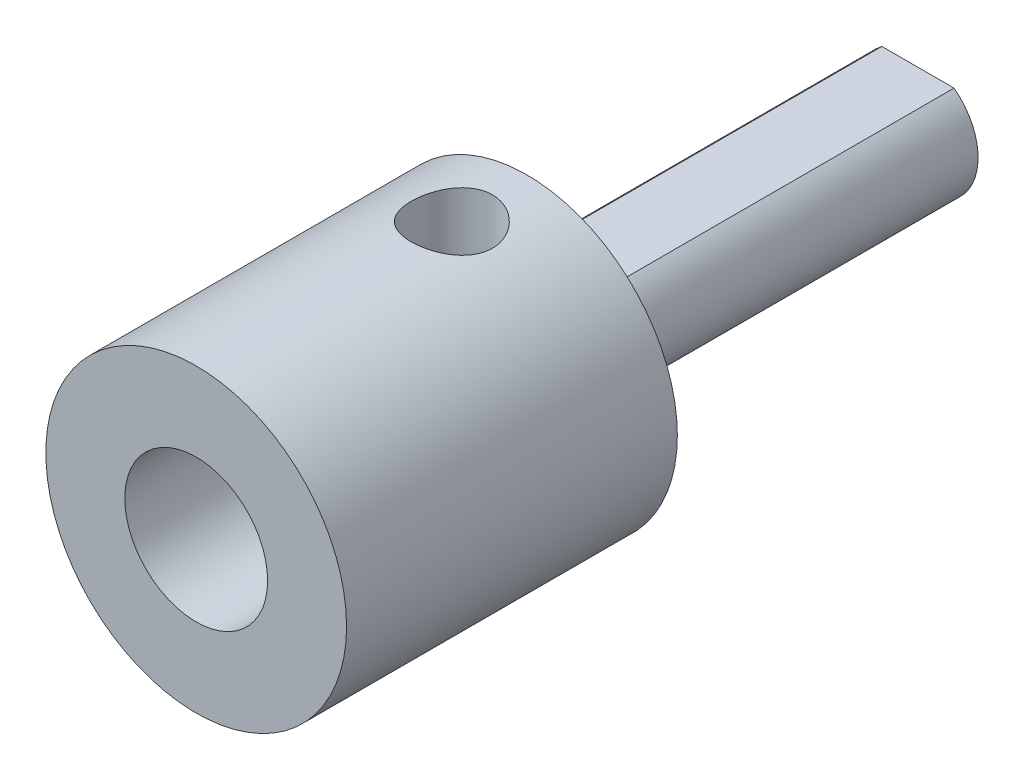
ISO-10303-21;
HEADER;
FILE_DESCRIPTION(('STEP AP214'),'2;1');
FILE_NAME('part.step','',(''),(''),'','','');
FILE_SCHEMA(('AUTOMOTIVE_DESIGN { 1 0 10303 214 1 1 1 1 }'));
ENDSEC;
DATA;
#1=APPLICATION_CONTEXT('core data for automotive mechanical design processes');
#2=APPLICATION_PROTOCOL_DEFINITION('international standard','automotive_design',2000,#1);
#3=PRODUCT_CONTEXT('',#1,'mechanical');
#4=PRODUCT('Part','Part','',(#3));
#5=PRODUCT_RELATED_PRODUCT_CATEGORY('part','',(#4));
#6=PRODUCT_DEFINITION_FORMATION('','',#4);
#7=PRODUCT_DEFINITION_CONTEXT('part definition',#1,'design');
#8=PRODUCT_DEFINITION('design','',#6,#7);
#9=PRODUCT_DEFINITION_SHAPE('','',#8);
#10=(LENGTH_UNIT() NAMED_UNIT(*) SI_UNIT(.MILLI.,.METRE.));
#11=(NAMED_UNIT(*) PLANE_ANGLE_UNIT() SI_UNIT($,.RADIAN.));
#12=(NAMED_UNIT(*) SI_UNIT($,.STERADIAN.) SOLID_ANGLE_UNIT());
#13=UNCERTAINTY_MEASURE_WITH_UNIT(LENGTH_MEASURE(1.E-05),#10,'distance_accuracy_value','');
#14=(GEOMETRIC_REPRESENTATION_CONTEXT(3) GLOBAL_UNCERTAINTY_ASSIGNED_CONTEXT((#13)) GLOBAL_UNIT_ASSIGNED_CONTEXT((#10,
#11,#12)) REPRESENTATION_CONTEXT('',''));
#15=CARTESIAN_POINT('',(0.,0.,0.));
#16=DIRECTION('',(0.,0.,1.));
#17=DIRECTION('',(1.,0.,0.));
#18=AXIS2_PLACEMENT_3D('',#15,#16,#17);
#19=CARTESIAN_POINT('',(0.,0.,0.));
#20=DIRECTION('',(0.,0.,1.));
#21=DIRECTION('',(1.,0.,0.));
#22=AXIS2_PLACEMENT_3D('',#19,#20,#21);
#23=PLANE('',#22);
#24=CARTESIAN_POINT('',(0.,0.,0.));
#25=DIRECTION('',(0.,0.,1.));
#26=DIRECTION('',(1.,0.,0.));
#27=AXIS2_PLACEMENT_3D('',#24,#25,#26);
#28=CIRCLE('',#27,5.);
#29=CARTESIAN_POINT('',(5.,0.,0.));
#30=VERTEX_POINT('',#29);
#31=EDGE_CURVE('E91',#30,#30,#28,.T.);
#32=ORIENTED_EDGE('',*,*,#31,.F.);
#33=EDGE_LOOP('',(#32));
#34=FACE_BOUND('',#33,.T.);
#35=CARTESIAN_POINT('',(0.,0.,0.));
#36=DIRECTION('',(0.,0.,-1.));
#37=DIRECTION('',(-1.,0.,0.));
#38=AXIS2_PLACEMENT_3D('',#35,#36,#37);
#39=CIRCLE('',#38,2.);
#40=CARTESIAN_POINT('',(1.2,1.6,0.));
#41=VERTEX_POINT('',#40);
#42=CARTESIAN_POINT('',(-1.2,1.6,0.));
#43=VERTEX_POINT('',#42);
#44=EDGE_CURVE('E56',#41,#43,#39,.T.);
#45=ORIENTED_EDGE('',*,*,#44,.F.);
#46=DIRECTION('',(-1.,0.,0.));
#47=VECTOR('',#46,1.);
#48=CARTESIAN_POINT('',(0.,1.6,0.));
#49=LINE('',#48,#47);
#50=EDGE_CURVE('E70',#41,#43,#49,.T.);
#51=ORIENTED_EDGE('',*,*,#50,.T.);
#52=EDGE_LOOP('',(#45,#51));
#53=FACE_BOUND('',#52,.T.);
#54=ADVANCED_FACE('F37',(#34,#53),#23,.F.);
#55=CARTESIAN_POINT('',(0.,0.,11.));
#56=DIRECTION('',(0.,0.,-1.));
#57=DIRECTION('',(-1.,0.,0.));
#58=AXIS2_PLACEMENT_3D('',#55,#56,#57);
#59=CYLINDRICAL_SURFACE('',#58,5.);
#60=CARTESIAN_POINT('',(0.,-5.,3.85254999999999));
#61=CARTESIAN_POINT('',(0.0745225185418701,-4.99999891715454,3.85254831498077));
#62=CARTESIAN_POINT('',(0.149062933026172,-4.99831757249608,3.84637033325616));
#63=CARTESIAN_POINT('',(0.29599386979551,-4.9917737409468,3.82186699812973));
#64=CARTESIAN_POINT('',(0.368383385110954,-4.98690978786678,3.80353604594991));
#65=CARTESIAN_POINT('',(0.50887059643589,-4.9745371678472,3.75536830363393));
#66=CARTESIAN_POINT('',(0.57697377998375,-4.96703196701687,3.72554658798245));
#67=CARTESIAN_POINT('',(0.707212208082806,-4.95016856283296,3.65530039542611));
#68=CARTESIAN_POINT('',(0.769347008814859,-4.94081022183489,3.61487513085584));
#69=CARTESIAN_POINT('',(0.887363728693609,-4.9210005306576,3.52355373816625));
#70=CARTESIAN_POINT('',(0.943083368346109,-4.91053007485072,3.47245203438852));
#71=CARTESIAN_POINT('',(1.04527549491167,-4.8897979315681,3.36166765668391));
#72=CARTESIAN_POINT('',(1.09174675439663,-4.87953627196544,3.30198384556364));
#73=CARTESIAN_POINT('',(1.17492101197207,-4.86018744137242,3.17442564231554));
#74=CARTESIAN_POINT('',(1.21143607903852,-4.85112433755132,3.10642472307627));
#75=CARTESIAN_POINT('',(1.27245048640325,-4.83548020361871,2.96496388108358));
#76=CARTESIAN_POINT('',(1.29695211396531,-4.82889870108512,2.89150500055209));
#77=CARTESIAN_POINT('',(1.33267816037057,-4.81916041200351,2.74301360043194));
#78=CARTESIAN_POINT('',(1.34419736621195,-4.81592772898658,2.66805710459758));
#79=CARTESIAN_POINT('',(1.354550801524,-4.8130264385934,2.51721118202058));
#80=CARTESIAN_POINT('',(1.35338747589842,-4.81335714427668,2.44132193790814));
#81=CARTESIAN_POINT('',(1.33864262599477,-4.81747741093888,2.29307586458958));
#82=CARTESIAN_POINT('',(1.32541914180672,-4.82116724106982,2.22068020934258));
#83=CARTESIAN_POINT('',(1.28750333862209,-4.83143013592613,2.07917543304961));
#84=CARTESIAN_POINT('',(1.26281007931925,-4.83800343703956,2.01006658197207));
#85=CARTESIAN_POINT('',(1.20236706472501,-4.85337941864864,1.87617024990532));
#86=CARTESIAN_POINT('',(1.16649283513454,-4.86220698464018,1.81144193723515));
#87=CARTESIAN_POINT('',(1.084793011612,-4.88108363177096,1.68879873301806));
#88=CARTESIAN_POINT('',(1.03896540763676,-4.89113295945924,1.63088522133975));
#89=CARTESIAN_POINT('',(0.936834771501843,-4.9117347953631,1.52147149581437));
#90=CARTESIAN_POINT('',(0.880231446744117,-4.92229286385737,1.47025222848972));
#91=CARTESIAN_POINT('',(0.759109365721067,-4.94242009197054,1.37797461650734));
#92=CARTESIAN_POINT('',(0.694590279478356,-4.95198921033328,1.33691669565213));
#93=CARTESIAN_POINT('',(0.55902482682546,-4.96912207851947,1.26599855802969));
#94=CARTESIAN_POINT('',(0.487949946060017,-4.97667645262231,1.23619043494803));
#95=CARTESIAN_POINT('',(0.341546492757304,-4.98886094697425,1.18902769673602));
#96=CARTESIAN_POINT('',(0.266218881738206,-4.99349172537009,1.171670278639));
#97=CARTESIAN_POINT('',(0.115844861748639,-4.99920722814325,1.15034568814558));
#98=CARTESIAN_POINT('',(0.0408563602438515,-5.00039303990367,1.14599668661598));
#99=CARTESIAN_POINT('',(-0.108778968102476,-4.99937628342001,1.14975618532833));
#100=CARTESIAN_POINT('',(-0.18342583051351,-4.99717407635451,1.15786335768404));
#101=CARTESIAN_POINT('',(-0.328887528750957,-4.98969412802459,1.18599230873376));
#102=CARTESIAN_POINT('',(-0.399746869171298,-4.98447168346502,1.20580000192707));
#103=CARTESIAN_POINT('',(-0.537129218064343,-4.97154474876873,1.25651814103433));
#104=CARTESIAN_POINT('',(-0.603651748859669,-4.96383998577081,1.2874298075612));
#105=CARTESIAN_POINT('',(-0.731947222220643,-4.94656753342053,1.36017916401072));
#106=CARTESIAN_POINT('',(-0.793598493546165,-4.9369656526649,1.40222310185792));
#107=CARTESIAN_POINT('',(-0.909104376659809,-4.91700831416227,1.49578523624903));
#108=CARTESIAN_POINT('',(-0.962957398166668,-4.9066527033538,1.54730536040303));
#109=CARTESIAN_POINT('',(-1.06295529758321,-4.88598127184649,1.66014105658185));
#110=CARTESIAN_POINT('',(-1.10883046135265,-4.87567536665577,1.72169792541274));
#111=CARTESIAN_POINT('',(-1.18960710423539,-4.85660004863629,1.85185517154865));
#112=CARTESIAN_POINT('',(-1.22450902982018,-4.84783057330078,1.92045526213325));
#113=CARTESIAN_POINT('',(-1.28208641194615,-4.83292245799489,2.06241863043107));
#114=CARTESIAN_POINT('',(-1.30483179467462,-4.82676881422789,2.13575188610576));
#115=CARTESIAN_POINT('',(-1.33760996250244,-4.81778931902919,2.28539789859631));
#116=CARTESIAN_POINT('',(-1.3476461120159,-4.81496258690466,2.36170986136638));
#117=CARTESIAN_POINT('',(-1.35452331821825,-4.81303203765954,2.51238152175697));
#118=CARTESIAN_POINT('',(-1.35179850115791,-4.81380572886924,2.58672012704893));
#119=CARTESIAN_POINT('',(-1.33424135718207,-4.81870120869171,2.73383546787176));
#120=CARTESIAN_POINT('',(-1.31940935918101,-4.82282290634955,2.80661224577748));
#121=CARTESIAN_POINT('',(-1.27831390640485,-4.83387600962356,2.94797385201618));
#122=CARTESIAN_POINT('',(-1.25214496237974,-4.84078415382057,3.01658810313876));
#123=CARTESIAN_POINT('',(-1.18919172462283,-4.85663174856998,3.14850467916756));
#124=CARTESIAN_POINT('',(-1.15240572195191,-4.86557152608811,3.21180614680048));
#125=CARTESIAN_POINT('',(-1.06795757203887,-4.88481247608129,3.33336623690192));
#126=CARTESIAN_POINT('',(-1.02000038776867,-4.89514662137543,3.39141470105638));
#127=CARTESIAN_POINT('',(-0.915128993800851,-4.91583061201491,3.49878113197134));
#128=CARTESIAN_POINT('',(-0.85821259526013,-4.92618046058319,3.54809695897137));
#129=CARTESIAN_POINT('',(-0.735513498938369,-4.946004645656,3.63767656489852));
#130=CARTESIAN_POINT('',(-0.66956197626517,-4.95545443576335,3.67771500599581));
#131=CARTESIAN_POINT('',(-0.531610130662581,-4.97214273531939,3.74607367867092));
#132=CARTESIAN_POINT('',(-0.459613611471916,-4.9793826222218,3.77440121368677));
#133=CARTESIAN_POINT('',(-0.32326715845194,-4.98993181246584,3.81496332304056));
#134=CARTESIAN_POINT('',(-0.259488809547496,-4.99367947926639,3.82902502123403));
#135=CARTESIAN_POINT('',(-0.1304781107203,-4.99871391778584,3.8478186072404));
#136=CARTESIAN_POINT('',(-0.0652459142870346,-5.00000094805226,3.85255147526709));
#137=CARTESIAN_POINT('',(0.,-5.,3.85254999999999));
#138=B_SPLINE_CURVE_WITH_KNOTS('',3,(#60,#61,#62,#63,#64,#65,#66,#67,#68,#69,#70,#71,#72,#73,
#74,#75,#76,#77,#78,#79,#80,#81,#82,#83,#84,#85,#86,#87,#88,#89,#90,#91,#92,#93,#94,#95,#96,#97,
#98,#99,#100,#101,#102,#103,#104,#105,#106,#107,#108,#109,#110,#111,#112,#113,#114,#115,#116,
#117,#118,#119,#120,#121,#122,#123,#124,#125,#126,#127,#128,#129,#130,#131,#132,#133,#134,#135,
#136,#137),.UNSPECIFIED.,.T.,.F.,(4,2,2,2,2,2,2,2,2,2,2,2,2,2,2,2,2,2,2,2,2,2,2,2,2,2,2,2,2,2,2,
2,2,2,2,2,2,2,4),(0.,0.223328240071187,0.446759437267955,0.669898512412245,0.893054167734646,
1.120985668944,1.34894740066142,1.5809535170925,1.8129154442266,2.03949693394301,
2.26603474467196,2.48605858962697,2.70610047559203,2.92868522848933,3.15131497332918,
3.381426755652,3.61154813370365,3.84272241292757,4.07384463266284,4.29811281376289,
4.52235708848744,4.74262016412743,4.96290745977075,5.18760259576699,5.4123434890508,
5.64362027688297,5.87488765346766,6.10481002534246,6.33467151896625,6.55677107988131,
6.77886460724308,6.99914123854049,7.21945334571729,7.44642213132786,7.67344645443626,
7.90551228359271,8.13743316712962,8.33298193267733,8.52851015011636),.UNSPECIFIED.);
#139=CARTESIAN_POINT('',(0.,-5.,3.85254999999999));
#140=VERTEX_POINT('',#139);
#141=EDGE_CURVE('E11',#140,#140,#138,.T.);
#142=ORIENTED_EDGE('',*,*,#141,.T.);
#143=EDGE_LOOP('',(#142));
#144=FACE_BOUND('',#143,.T.);
#145=CARTESIAN_POINT('',(0.,5.,3.85254999999999));
#146=CARTESIAN_POINT('',(-0.0745225185418701,4.99999891715454,3.85254831498077));
#147=CARTESIAN_POINT('',(-0.149062933026172,4.99831757249608,3.84637033325616));
#148=CARTESIAN_POINT('',(-0.29599386979551,4.9917737409468,3.82186699812973));
#149=CARTESIAN_POINT('',(-0.368383385110954,4.98690978786678,3.80353604594991));
#150=CARTESIAN_POINT('',(-0.508870596435891,4.9745371678472,3.75536830363393));
#151=CARTESIAN_POINT('',(-0.57697377998375,4.96703196701687,3.72554658798245));
#152=CARTESIAN_POINT('',(-0.707212208082806,4.95016856283296,3.65530039542611));
#153=CARTESIAN_POINT('',(-0.769347008814859,4.94081022183489,3.61487513085584));
#154=CARTESIAN_POINT('',(-0.887363728693609,4.9210005306576,3.52355373816625));
#155=CARTESIAN_POINT('',(-0.943083368346109,4.91053007485072,3.47245203438852));
#156=CARTESIAN_POINT('',(-1.04527549491167,4.8897979315681,3.36166765668391));
#157=CARTESIAN_POINT('',(-1.09174675439663,4.87953627196544,3.30198384556364));
#158=CARTESIAN_POINT('',(-1.17492101197207,4.86018744137242,3.17442564231554));
#159=CARTESIAN_POINT('',(-1.21143607903852,4.85112433755132,3.10642472307627));
#160=CARTESIAN_POINT('',(-1.27245048640325,4.83548020361871,2.96496388108358));
#161=CARTESIAN_POINT('',(-1.29695211396531,4.82889870108512,2.89150500055209));
#162=CARTESIAN_POINT('',(-1.33267816037057,4.81916041200351,2.74301360043194));
#163=CARTESIAN_POINT('',(-1.34419736621195,4.81592772898658,2.66805710459758));
#164=CARTESIAN_POINT('',(-1.354550801524,4.8130264385934,2.51721118202058));
#165=CARTESIAN_POINT('',(-1.35338747589842,4.81335714427668,2.44132193790814));
#166=CARTESIAN_POINT('',(-1.33864262599477,4.81747741093888,2.29307586458958));
#167=CARTESIAN_POINT('',(-1.32541914180672,4.82116724106982,2.22068020934258));
#168=CARTESIAN_POINT('',(-1.28750333862209,4.83143013592613,2.07917543304961));
#169=CARTESIAN_POINT('',(-1.26281007931925,4.83800343703956,2.01006658197207));
#170=CARTESIAN_POINT('',(-1.202367064725,4.85337941864864,1.87617024990532));
#171=CARTESIAN_POINT('',(-1.16649283513454,4.86220698464018,1.81144193723515));
#172=CARTESIAN_POINT('',(-1.084793011612,4.88108363177096,1.68879873301806));
#173=CARTESIAN_POINT('',(-1.03896540763676,4.89113295945924,1.63088522133975));
#174=CARTESIAN_POINT('',(-0.936834771501842,4.9117347953631,1.52147149581436));
#175=CARTESIAN_POINT('',(-0.880231446744117,4.92229286385737,1.47025222848972));
#176=CARTESIAN_POINT('',(-0.759109365721067,4.94242009197054,1.37797461650734));
#177=CARTESIAN_POINT('',(-0.694590279478355,4.95198921033329,1.33691669565213));
#178=CARTESIAN_POINT('',(-0.559024826825459,4.96912207851947,1.26599855802969));
#179=CARTESIAN_POINT('',(-0.487949946060016,4.97667645262231,1.23619043494803));
#180=CARTESIAN_POINT('',(-0.341546492757303,4.98886094697425,1.18902769673602));
#181=CARTESIAN_POINT('',(-0.266218881738205,4.99349172537009,1.171670278639));
#182=CARTESIAN_POINT('',(-0.115844861748638,4.99920722814325,1.15034568814558));
#183=CARTESIAN_POINT('',(-0.0408563602438501,5.00039303990367,1.14599668661598));
#184=CARTESIAN_POINT('',(0.108778968102478,4.99937628342001,1.14975618532833));
#185=CARTESIAN_POINT('',(0.183425830513511,4.99717407635451,1.15786335768404));
#186=CARTESIAN_POINT('',(0.328887528750958,4.98969412802459,1.18599230873376));
#187=CARTESIAN_POINT('',(0.399746869171299,4.98447168346502,1.20580000192707));
#188=CARTESIAN_POINT('',(0.537129218064343,4.97154474876873,1.25651814103433));
#189=CARTESIAN_POINT('',(0.60365174885967,4.96383998577081,1.2874298075612));
#190=CARTESIAN_POINT('',(0.731947222220643,4.94656753342053,1.36017916401072));
#191=CARTESIAN_POINT('',(0.793598493546165,4.9369656526649,1.40222310185792));
#192=CARTESIAN_POINT('',(0.909104376659809,4.91700831416227,1.49578523624903));
#193=CARTESIAN_POINT('',(0.962957398166669,4.9066527033538,1.54730536040303));
#194=CARTESIAN_POINT('',(1.06295529758321,4.88598127184649,1.66014105658185));
#195=CARTESIAN_POINT('',(1.10883046135265,4.87567536665577,1.72169792541274));
#196=CARTESIAN_POINT('',(1.18960710423539,4.85660004863629,1.85185517154865));
#197=CARTESIAN_POINT('',(1.22450902982019,4.84783057330078,1.92045526213325));
#198=CARTESIAN_POINT('',(1.28208641194615,4.83292245799489,2.06241863043107));
#199=CARTESIAN_POINT('',(1.30483179467462,4.82676881422789,2.13575188610576));
#200=CARTESIAN_POINT('',(1.33760996250244,4.81778931902919,2.28539789859631));
#201=CARTESIAN_POINT('',(1.3476461120159,4.81496258690466,2.36170986136638));
#202=CARTESIAN_POINT('',(1.35452331821825,4.81303203765954,2.51238152175697));
#203=CARTESIAN_POINT('',(1.35179850115791,4.81380572886923,2.58672012704894));
#204=CARTESIAN_POINT('',(1.33424135718207,4.81870120869171,2.73383546787176));
#205=CARTESIAN_POINT('',(1.31940935918101,4.82282290634955,2.80661224577748));
#206=CARTESIAN_POINT('',(1.27831390640485,4.83387600962356,2.94797385201618));
#207=CARTESIAN_POINT('',(1.25214496237974,4.84078415382057,3.01658810313876));
#208=CARTESIAN_POINT('',(1.18919172462283,4.85663174856998,3.14850467916756));
#209=CARTESIAN_POINT('',(1.15240572195191,4.86557152608811,3.21180614680048));
#210=CARTESIAN_POINT('',(1.06795757203887,4.88481247608129,3.33336623690192));
#211=CARTESIAN_POINT('',(1.02000038776867,4.89514662137543,3.39141470105638));
#212=CARTESIAN_POINT('',(0.915128993800849,4.91583061201491,3.49878113197134));
#213=CARTESIAN_POINT('',(0.858212595260129,4.92618046058319,3.54809695897138));
#214=CARTESIAN_POINT('',(0.735513498938368,4.946004645656,3.63767656489852));
#215=CARTESIAN_POINT('',(0.669561976265168,4.95545443576335,3.67771500599581));
#216=CARTESIAN_POINT('',(0.531610130662579,4.97214273531939,3.74607367867092));
#217=CARTESIAN_POINT('',(0.459613611471914,4.9793826222218,3.77440121368677));
#218=CARTESIAN_POINT('',(0.323267158451938,4.98993181246584,3.81496332304056));
#219=CARTESIAN_POINT('',(0.259488809547496,4.99367947926639,3.82902502123403));
#220=CARTESIAN_POINT('',(0.1304781107203,4.99871391778584,3.8478186072404));
#221=CARTESIAN_POINT('',(0.0652459142870346,5.00000094805226,3.85255147526709));
#222=CARTESIAN_POINT('',(0.,5.,3.85254999999999));
#223=B_SPLINE_CURVE_WITH_KNOTS('',3,(#145,#146,#147,#148,#149,#150,#151,#152,#153,#154,#155,
#156,#157,#158,#159,#160,#161,#162,#163,#164,#165,#166,#167,#168,#169,#170,#171,#172,#173,#174,
#175,#176,#177,#178,#179,#180,#181,#182,#183,#184,#185,#186,#187,#188,#189,#190,#191,#192,#193,
#194,#195,#196,#197,#198,#199,#200,#201,#202,#203,#204,#205,#206,#207,#208,#209,#210,#211,#212,
#213,#214,#215,#216,#217,#218,#219,#220,#221,#222),.UNSPECIFIED.,.T.,.F.,(4,2,2,2,2,2,2,2,2,2,2,
2,2,2,2,2,2,2,2,2,2,2,2,2,2,2,2,2,2,2,2,2,2,2,2,2,2,2,4),(0.,0.223328240071187,
0.446759437267955,0.669898512412245,0.893054167734647,1.120985668944,1.34894740066142,
1.5809535170925,1.8129154442266,2.03949693394301,2.26603474467196,2.48605858962697,
2.70610047559203,2.92868522848933,3.15131497332918,3.381426755652,3.61154813370365,
3.84272241292757,4.07384463266284,4.29811281376289,4.52235708848744,4.74262016412743,
4.96290745977075,5.18760259576699,5.4123434890508,5.64362027688297,5.87488765346766,
6.10481002534246,6.33467151896625,6.55677107988131,6.77886460724308,6.99914123854049,
7.2194533457173,7.44642213132786,7.67344645443626,7.90551228359271,8.13743316712962,
8.33298193267733,8.52851015011636),.UNSPECIFIED.);
#224=CARTESIAN_POINT('',(0.,5.,3.85254999999999));
#225=VERTEX_POINT('',#224);
#226=EDGE_CURVE('E50',#225,#225,#223,.T.);
#227=ORIENTED_EDGE('',*,*,#226,.T.);
#228=EDGE_LOOP('',(#227));
#229=FACE_BOUND('',#228,.T.);
#230=CARTESIAN_POINT('',(0.,0.,11.));
#231=DIRECTION('',(0.,0.,1.));
#232=DIRECTION('',(1.,0.,0.));
#233=AXIS2_PLACEMENT_3D('',#230,#231,#232);
#234=CIRCLE('',#233,5.);
#235=CARTESIAN_POINT('',(5.,0.,11.));
#236=VERTEX_POINT('',#235);
#237=EDGE_CURVE('E94',#236,#236,#234,.T.);
#238=ORIENTED_EDGE('',*,*,#237,.F.);
#239=EDGE_LOOP('',(#238));
#240=FACE_BOUND('',#239,.T.);
#241=ORIENTED_EDGE('',*,*,#31,.T.);
#242=EDGE_LOOP('',(#241));
#243=FACE_BOUND('',#242,.T.);
#244=ADVANCED_FACE('F39',(#144,#229,#240,#243),#59,.T.);
#245=CARTESIAN_POINT('',(0.,0.,11.));
#246=DIRECTION('',(0.,0.,1.));
#247=DIRECTION('',(1.,0.,0.));
#248=AXIS2_PLACEMENT_3D('',#245,#246,#247);
#249=PLANE('',#248);
#250=CARTESIAN_POINT('',(0.,0.,11.));
#251=DIRECTION('',(0.,0.,1.));
#252=DIRECTION('',(1.,0.,0.));
#253=AXIS2_PLACEMENT_3D('',#250,#251,#252);
#254=CIRCLE('',#253,2.375);
#255=CARTESIAN_POINT('',(2.375,0.,11.));
#256=VERTEX_POINT('',#255);
#257=EDGE_CURVE('E87',#256,#256,#254,.T.);
#258=ORIENTED_EDGE('',*,*,#257,.F.);
#259=EDGE_LOOP('',(#258));
#260=FACE_BOUND('',#259,.T.);
#261=ORIENTED_EDGE('',*,*,#237,.T.);
#262=EDGE_LOOP('',(#261));
#263=FACE_BOUND('',#262,.T.);
#264=ADVANCED_FACE('F122',(#260,#263),#249,.T.);
#265=CARTESIAN_POINT('',(0.,0.,7.));
#266=DIRECTION('',(0.,0.,1.));
#267=DIRECTION('',(1.,0.,0.));
#268=AXIS2_PLACEMENT_3D('',#265,#266,#267);
#269=CYLINDRICAL_SURFACE('',#268,2.375);
#270=CARTESIAN_POINT('',(0.,0.,7.));
#271=DIRECTION('',(0.,0.,1.));
#272=DIRECTION('',(1.,0.,0.));
#273=AXIS2_PLACEMENT_3D('',#270,#271,#272);
#274=CIRCLE('',#273,2.375);
#275=CARTESIAN_POINT('',(2.375,0.,7.));
#276=VERTEX_POINT('',#275);
#277=EDGE_CURVE('E88',#276,#276,#274,.T.);
#278=ORIENTED_EDGE('',*,*,#277,.F.);
#279=EDGE_LOOP('',(#278));
#280=FACE_BOUND('',#279,.T.);
#281=ORIENTED_EDGE('',*,*,#257,.T.);
#282=EDGE_LOOP('',(#281));
#283=FACE_BOUND('',#282,.T.);
#284=ADVANCED_FACE('F118',(#280,#283),#269,.F.);
#285=CARTESIAN_POINT('',(0.,0.,7.));
#286=DIRECTION('',(0.,0.,1.));
#287=DIRECTION('',(1.,0.,0.));
#288=AXIS2_PLACEMENT_3D('',#285,#286,#287);
#289=PLANE('',#288);
#290=ORIENTED_EDGE('',*,*,#277,.T.);
#291=EDGE_LOOP('',(#290));
#292=FACE_BOUND('',#291,.T.);
#293=ADVANCED_FACE('F115',(#292),#289,.T.);
#294=CARTESIAN_POINT('',(0.,1.6,-13.));
#295=DIRECTION('',(0.,1.,0.));
#296=DIRECTION('',(0.,0.,1.));
#297=AXIS2_PLACEMENT_3D('',#294,#295,#296);
#298=PLANE('',#297);
#299=ORIENTED_EDGE('',*,*,#50,.F.);
#300=DIRECTION('',(0.,0.,1.));
#301=VECTOR('',#300,1.);
#302=CARTESIAN_POINT('',(1.2,1.6,-13.));
#303=LINE('',#302,#301);
#304=CARTESIAN_POINT('',(1.2,1.6,-13.));
#305=VERTEX_POINT('',#304);
#306=EDGE_CURVE('E79',#305,#41,#303,.T.);
#307=ORIENTED_EDGE('',*,*,#306,.F.);
#308=DIRECTION('',(-1.,0.,0.));
#309=VECTOR('',#308,1.);
#310=CARTESIAN_POINT('',(0.,1.6,-13.));
#311=LINE('',#310,#309);
#312=CARTESIAN_POINT('',(-1.2,1.6,-13.));
#313=VERTEX_POINT('',#312);
#314=EDGE_CURVE('E77',#305,#313,#311,.T.);
#315=ORIENTED_EDGE('',*,*,#314,.T.);
#316=DIRECTION('',(0.,0.,1.));
#317=VECTOR('',#316,1.);
#318=CARTESIAN_POINT('',(-1.2,1.6,-13.));
#319=LINE('',#318,#317);
#320=EDGE_CURVE('E75',#313,#43,#319,.T.);
#321=ORIENTED_EDGE('',*,*,#320,.T.);
#322=EDGE_LOOP('',(#299,#307,#315,#321));
#323=FACE_BOUND('',#322,.T.);
#324=ADVANCED_FACE('F76',(#323),#298,.T.);
#325=CARTESIAN_POINT('',(0.,0.,-13.));
#326=DIRECTION('',(0.,0.,1.));
#327=DIRECTION('',(1.,0.,0.));
#328=AXIS2_PLACEMENT_3D('',#325,#326,#327);
#329=CYLINDRICAL_SURFACE('',#328,2.);
#330=ORIENTED_EDGE('',*,*,#44,.T.);
#331=ORIENTED_EDGE('',*,*,#320,.F.);
#332=CARTESIAN_POINT('',(0.,0.,-13.));
#333=DIRECTION('',(0.,0.,-1.));
#334=DIRECTION('',(-1.,0.,0.));
#335=AXIS2_PLACEMENT_3D('',#332,#333,#334);
#336=CIRCLE('',#335,2.);
#337=EDGE_CURVE('E64',#305,#313,#336,.T.);
#338=ORIENTED_EDGE('',*,*,#337,.F.);
#339=ORIENTED_EDGE('',*,*,#306,.T.);
#340=EDGE_LOOP('',(#330,#331,#338,#339));
#341=FACE_BOUND('',#340,.T.);
#342=ADVANCED_FACE('F81',(#341),#329,.T.);
#343=CARTESIAN_POINT('',(0.,0.,-13.));
#344=DIRECTION('',(0.,0.,-1.));
#345=DIRECTION('',(-1.,0.,0.));
#346=AXIS2_PLACEMENT_3D('',#343,#344,#345);
#347=PLANE('',#346);
#348=ORIENTED_EDGE('',*,*,#314,.F.);
#349=ORIENTED_EDGE('',*,*,#337,.T.);
#350=EDGE_LOOP('',(#348,#349));
#351=FACE_BOUND('',#350,.T.);
#352=ADVANCED_FACE('F106',(#351),#347,.T.);
#353=CARTESIAN_POINT('',(0.,5.,2.5));
#354=DIRECTION('',(0.,1.,0.));
#355=DIRECTION('',(0.,0.,1.));
#356=AXIS2_PLACEMENT_3D('',#353,#354,#355);
#357=CYLINDRICAL_SURFACE('',#356,1.35254999999999);
#358=ORIENTED_EDGE('',*,*,#226,.F.);
#359=EDGE_LOOP('',(#358));
#360=FACE_BOUND('',#359,.T.);
#361=ORIENTED_EDGE('',*,*,#141,.F.);
#362=EDGE_LOOP('',(#361));
#363=FACE_BOUND('',#362,.T.);
#364=ADVANCED_FACE('F102',(#360,#363),#357,.F.);
#365=CLOSED_SHELL('',(#54,#244,#264,#284,#293,#324,#342,#352,#364));
#366=MANIFOLD_SOLID_BREP('B2',#365);
#367=ADVANCED_BREP_SHAPE_REPRESENTATION('',(#18,#366),#14);
#368=SHAPE_DEFINITION_REPRESENTATION(#9,#367);
ENDSEC;
END-ISO-10303-21;
